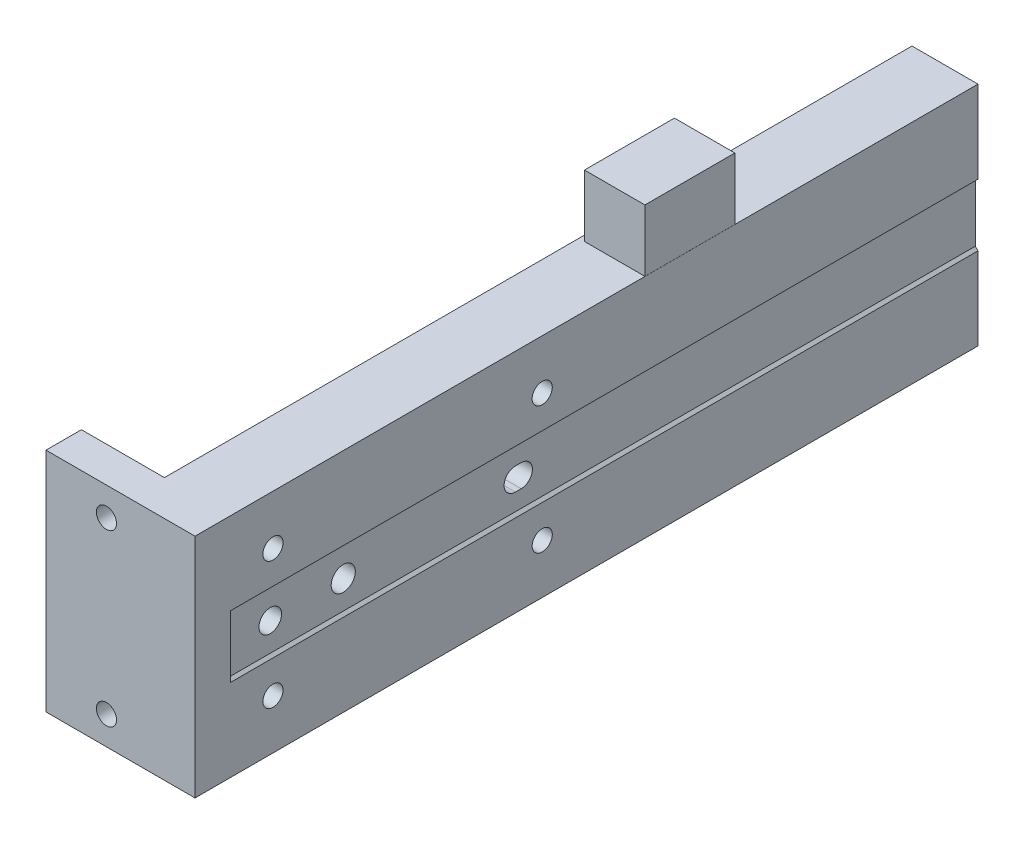
ISO-10303-21;
HEADER;
FILE_DESCRIPTION(('STEP AP214'),'2;1');
FILE_NAME('part.step','',(''),(''),'','','');
FILE_SCHEMA(('AUTOMOTIVE_DESIGN { 1 0 10303 214 1 1 1 1 }'));
ENDSEC;
DATA;
#1=APPLICATION_CONTEXT('core data for automotive mechanical design processes');
#2=APPLICATION_PROTOCOL_DEFINITION('international standard','automotive_design',2000,#1);
#3=PRODUCT_CONTEXT('',#1,'mechanical');
#4=PRODUCT('Part','Part','',(#3));
#5=PRODUCT_RELATED_PRODUCT_CATEGORY('part','',(#4));
#6=PRODUCT_DEFINITION_FORMATION('','',#4);
#7=PRODUCT_DEFINITION_CONTEXT('part definition',#1,'design');
#8=PRODUCT_DEFINITION('design','',#6,#7);
#9=PRODUCT_DEFINITION_SHAPE('','',#8);
#10=(LENGTH_UNIT() NAMED_UNIT(*) SI_UNIT(.MILLI.,.METRE.));
#11=(NAMED_UNIT(*) PLANE_ANGLE_UNIT() SI_UNIT($,.RADIAN.));
#12=(NAMED_UNIT(*) SI_UNIT($,.STERADIAN.) SOLID_ANGLE_UNIT());
#13=UNCERTAINTY_MEASURE_WITH_UNIT(LENGTH_MEASURE(1.E-05),#10,'distance_accuracy_value','');
#14=(GEOMETRIC_REPRESENTATION_CONTEXT(3) GLOBAL_UNCERTAINTY_ASSIGNED_CONTEXT((#13)) GLOBAL_UNIT_ASSIGNED_CONTEXT((#10,
#11,#12)) REPRESENTATION_CONTEXT('',''));
#15=CARTESIAN_POINT('',(0.,0.,0.));
#16=DIRECTION('',(0.,0.,1.));
#17=DIRECTION('',(1.,0.,0.));
#18=AXIS2_PLACEMENT_3D('',#15,#16,#17);
#19=CARTESIAN_POINT('',(-5.12130000000008,16.0000000000001,-899.276836465885));
#20=DIRECTION('',(0.,-1.,0.));
#21=DIRECTION('',(0.,0.,-1.));
#22=AXIS2_PLACEMENT_3D('',#19,#20,#21);
#23=PLANE('',#22);
#24=DIRECTION('',(-1.,0.,0.));
#25=VECTOR('',#24,1.);
#26=CARTESIAN_POINT('',(-5.12130000000008,16.0000000000001,-937.568622791415));
#27=LINE('',#26,#25);
#28=CARTESIAN_POINT('',(15.9086999999999,16.0000000000001,-937.568622791415));
#29=VERTEX_POINT('',#28);
#30=CARTESIAN_POINT('',(-5.12130000000008,16.0000000000001,-937.568622791415));
#31=VERTEX_POINT('',#30);
#32=EDGE_CURVE('E409',#29,#31,#27,.T.);
#33=ORIENTED_EDGE('',*,*,#32,.F.);
#34=DIRECTION('',(0.,0.,-1.));
#35=VECTOR('',#34,1.);
#36=CARTESIAN_POINT('',(15.9086999999999,16.0000000000001,-899.276836465885));
#37=LINE('',#36,#35);
#38=CARTESIAN_POINT('',(15.9086999999999,16.0000000000001,-1048.06862279141));
#39=VERTEX_POINT('',#38);
#40=EDGE_CURVE('E414',#29,#39,#37,.T.);
#41=ORIENTED_EDGE('',*,*,#40,.T.);
#42=DIRECTION('',(-1.,0.,0.));
#43=VECTOR('',#42,1.);
#44=CARTESIAN_POINT('',(15.9086999999999,16.0000000000001,-1048.06862279141));
#45=LINE('',#44,#43);
#46=CARTESIAN_POINT('',(6.59129999999991,16.0000000000001,-1048.06862279141));
#47=VERTEX_POINT('',#46);
#48=EDGE_CURVE('E303',#39,#47,#45,.T.);
#49=ORIENTED_EDGE('',*,*,#48,.T.);
#50=DIRECTION('',(0.,0.,1.));
#51=VECTOR('',#50,1.);
#52=CARTESIAN_POINT('',(6.59129999999991,16.0000000000001,-1081.3974983014));
#53=LINE('',#52,#51);
#54=CARTESIAN_POINT('',(6.59129999999991,16.0000000000001,-942.568622791415));
#55=VERTEX_POINT('',#54);
#56=EDGE_CURVE('E333',#47,#55,#53,.T.);
#57=ORIENTED_EDGE('',*,*,#56,.T.);
#58=DIRECTION('',(-1.,0.,0.));
#59=VECTOR('',#58,1.);
#60=CARTESIAN_POINT('',(-5.12130000000008,16.0000000000001,-942.568622791415));
#61=LINE('',#60,#59);
#62=CARTESIAN_POINT('',(-5.12130000000008,16.0000000000001,-942.568622791415));
#63=VERTEX_POINT('',#62);
#64=EDGE_CURVE('E412',#55,#63,#61,.T.);
#65=ORIENTED_EDGE('',*,*,#64,.T.);
#66=DIRECTION('',(0.,0.,-1.));
#67=VECTOR('',#66,1.);
#68=CARTESIAN_POINT('',(-5.12130000000008,16.0000000000001,-899.276836465885));
#69=LINE('',#68,#67);
#70=EDGE_CURVE('E325',#31,#63,#69,.T.);
#71=ORIENTED_EDGE('',*,*,#70,.F.);
#72=EDGE_LOOP('',(#33,#41,#49,#57,#65,#71));
#73=FACE_BOUND('',#72,.T.);
#74=DIRECTION('',(0.,0.,-1.));
#75=VECTOR('',#74,1.);
#76=CARTESIAN_POINT('',(15.8986999999999,16.0000000000002,-1001.06862279141));
#77=LINE('',#76,#75);
#78=CARTESIAN_POINT('',(15.8986999999999,16.0000000000002,-1001.06862279141));
#79=VERTEX_POINT('',#78);
#80=CARTESIAN_POINT('',(15.8986999999999,16.0000000000001,-1013.76862279141));
#81=VERTEX_POINT('',#80);
#82=EDGE_CURVE('E189',#79,#81,#77,.T.);
#83=ORIENTED_EDGE('',*,*,#82,.F.);
#84=DIRECTION('',(1.,0.,0.));
#85=VECTOR('',#84,1.);
#86=CARTESIAN_POINT('',(15.8986999999999,16.0000000000002,-1001.06862279141));
#87=LINE('',#86,#85);
#88=CARTESIAN_POINT('',(7.36869999999985,16.0000000000001,-1001.06862279141));
#89=VERTEX_POINT('',#88);
#90=EDGE_CURVE('E186',#89,#79,#87,.T.);
#91=ORIENTED_EDGE('',*,*,#90,.F.);
#92=DIRECTION('',(0.,0.,1.));
#93=VECTOR('',#92,1.);
#94=CARTESIAN_POINT('',(7.36869999999992,16.0000000000002,-1001.06862279141));
#95=LINE('',#94,#93);
#96=CARTESIAN_POINT('',(7.36869999999991,16.0000000000001,-1013.76862279141));
#97=VERTEX_POINT('',#96);
#98=EDGE_CURVE('E53',#97,#89,#95,.T.);
#99=ORIENTED_EDGE('',*,*,#98,.F.);
#100=DIRECTION('',(-1.,0.,0.));
#101=VECTOR('',#100,1.);
#102=CARTESIAN_POINT('',(15.8986999999999,16.0000000000002,-1013.76862279141));
#103=LINE('',#102,#101);
#104=EDGE_CURVE('E48',#81,#97,#103,.T.);
#105=ORIENTED_EDGE('',*,*,#104,.F.);
#106=EDGE_LOOP('',(#83,#91,#99,#105));
#107=FACE_BOUND('',#106,.T.);
#108=ADVANCED_FACE('F31',(#73,#107),#23,.F.);
#109=CARTESIAN_POINT('',(15.5287000000001,-4.,-899.276836465885));
#110=DIRECTION('',(-0.707106781186548,-0.707106781186547,0.));
#111=DIRECTION('',(0.707106781186547,-0.707106781186548,0.));
#112=AXIS2_PLACEMENT_3D('',#109,#110,#111);
#113=PLANE('',#112);
#114=DIRECTION('',(-0.707106781186547,0.707106781186548,0.));
#115=VECTOR('',#114,1.);
#116=CARTESIAN_POINT('',(15.9087000000001,-4.38,-942.568622791415));
#117=LINE('',#116,#115);
#118=CARTESIAN_POINT('',(15.9087000000001,-4.38,-942.568622791415));
#119=VERTEX_POINT('',#118);
#120=CARTESIAN_POINT('',(15.5287000000001,-4.,-942.568622791415));
#121=VERTEX_POINT('',#120);
#122=EDGE_CURVE('E296',#119,#121,#117,.T.);
#123=ORIENTED_EDGE('',*,*,#122,.F.);
#124=DIRECTION('',(0.,0.,-1.));
#125=VECTOR('',#124,1.);
#126=CARTESIAN_POINT('',(15.9087000000001,-4.38,-899.276836465885));
#127=LINE('',#126,#125);
#128=CARTESIAN_POINT('',(15.9087000000001,-4.38,-1048.06862279141));
#129=VERTEX_POINT('',#128);
#130=EDGE_CURVE('E423',#119,#129,#127,.T.);
#131=ORIENTED_EDGE('',*,*,#130,.T.);
#132=DIRECTION('',(-0.707106781186547,0.707106781186548,0.));
#133=VECTOR('',#132,1.);
#134=CARTESIAN_POINT('',(15.9087000000001,-4.38,-1048.06862279141));
#135=LINE('',#134,#133);
#136=CARTESIAN_POINT('',(15.5287000000001,-4.,-1048.06862279141));
#137=VERTEX_POINT('',#136);
#138=EDGE_CURVE('E316',#129,#137,#135,.T.);
#139=ORIENTED_EDGE('',*,*,#138,.T.);
#140=DIRECTION('',(0.,0.,-1.));
#141=VECTOR('',#140,1.);
#142=CARTESIAN_POINT('',(15.5287000000001,-4.,-899.276836465885));
#143=LINE('',#142,#141);
#144=EDGE_CURVE('E425',#121,#137,#143,.T.);
#145=ORIENTED_EDGE('',*,*,#144,.F.);
#146=EDGE_LOOP('',(#123,#131,#139,#145));
#147=FACE_BOUND('',#146,.T.);
#148=ADVANCED_FACE('F363',(#147),#113,.F.);
#149=CARTESIAN_POINT('',(15.5287000000001,4.,-899.276836465885));
#150=DIRECTION('',(-1.,0.,0.));
#151=DIRECTION('',(0.,0.,1.));
#152=AXIS2_PLACEMENT_3D('',#149,#150,#151);
#153=PLANE('',#152);
#154=CARTESIAN_POINT('',(15.5287000000001,1.11542008690021E-13,-948.568622791415));
#155=DIRECTION('',(1.,0.,0.));
#156=DIRECTION('',(0.,0.,-1.));
#157=AXIS2_PLACEMENT_3D('',#154,#155,#156);
#158=CIRCLE('',#157,1.59385000000001);
#159=CARTESIAN_POINT('',(15.5287000000001,1.11542008690021E-13,-950.162472791415));
#160=VERTEX_POINT('',#159);
#161=EDGE_CURVE('E190',#160,#160,#158,.T.);
#162=ORIENTED_EDGE('',*,*,#161,.F.);
#163=EDGE_LOOP('',(#162));
#164=FACE_BOUND('',#163,.T.);
#165=DIRECTION('',(0.,0.,-1.));
#166=VECTOR('',#165,1.);
#167=CARTESIAN_POINT('',(15.5287000000001,-1.59384999999989,-983.162472791415));
#168=LINE('',#167,#166);
#169=CARTESIAN_POINT('',(15.5287000000001,-1.59384999999989,-983.162472791415));
#170=VERTEX_POINT('',#169);
#171=CARTESIAN_POINT('',(15.5287000000001,-1.59384999999989,-983.974772791415));
#172=VERTEX_POINT('',#171);
#173=EDGE_CURVE('E217',#170,#172,#168,.T.);
#174=ORIENTED_EDGE('',*,*,#173,.F.);
#175=CARTESIAN_POINT('',(15.5287000000001,1.114425339159E-13,-983.162472791415));
#176=DIRECTION('',(1.,0.,0.));
#177=DIRECTION('',(0.,0.,-1.));
#178=AXIS2_PLACEMENT_3D('',#175,#176,#177);
#179=CIRCLE('',#178,1.59385);
#180=CARTESIAN_POINT('',(15.5287000000001,1.59385000000011,-983.162472791415));
#181=VERTEX_POINT('',#180);
#182=EDGE_CURVE('E201',#181,#170,#179,.T.);
#183=ORIENTED_EDGE('',*,*,#182,.F.);
#184=DIRECTION('',(0.,0.,1.));
#185=VECTOR('',#184,1.);
#186=CARTESIAN_POINT('',(15.5287000000001,1.59385000000011,-983.162472791415));
#187=LINE('',#186,#185);
#188=CARTESIAN_POINT('',(15.5287000000001,1.59385000000011,-983.974772791415));
#189=VERTEX_POINT('',#188);
#190=EDGE_CURVE('E206',#189,#181,#187,.T.);
#191=ORIENTED_EDGE('',*,*,#190,.F.);
#192=CARTESIAN_POINT('',(15.5287000000001,1.11542008690021E-13,-983.974772791415));
#193=DIRECTION('',(1.,0.,0.));
#194=DIRECTION('',(0.,0.,-1.));
#195=AXIS2_PLACEMENT_3D('',#192,#193,#194);
#196=CIRCLE('',#195,1.59385);
#197=EDGE_CURVE('E220',#172,#189,#196,.T.);
#198=ORIENTED_EDGE('',*,*,#197,.F.);
#199=EDGE_LOOP('',(#174,#183,#191,#198));
#200=FACE_BOUND('',#199,.T.);
#201=CARTESIAN_POINT('',(15.5287000000001,1.11542008690021E-13,-958.868622791415));
#202=DIRECTION('',(1.,0.,0.));
#203=DIRECTION('',(0.,0.,-1.));
#204=AXIS2_PLACEMENT_3D('',#201,#202,#203);
#205=CIRCLE('',#204,1.7);
#206=CARTESIAN_POINT('',(15.5287000000001,1.11542008690021E-13,-960.568622791415));
#207=VERTEX_POINT('',#206);
#208=EDGE_CURVE('E290',#207,#207,#205,.T.);
#209=ORIENTED_EDGE('',*,*,#208,.F.);
#210=EDGE_LOOP('',(#209));
#211=FACE_BOUND('',#210,.T.);
#212=DIRECTION('',(0.,1.,0.));
#213=VECTOR('',#212,1.);
#214=CARTESIAN_POINT('',(15.5287000000001,-4.,-942.568622791415));
#215=LINE('',#214,#213);
#216=CARTESIAN_POINT('',(15.5287000000001,4.,-942.568622791415));
#217=VERTEX_POINT('',#216);
#218=EDGE_CURVE('E294',#121,#217,#215,.T.);
#219=ORIENTED_EDGE('',*,*,#218,.F.);
#220=ORIENTED_EDGE('',*,*,#144,.T.);
#221=DIRECTION('',(0.,1.,0.));
#222=VECTOR('',#221,1.);
#223=CARTESIAN_POINT('',(15.5287000000001,-4.,-1048.06862279141));
#224=LINE('',#223,#222);
#225=CARTESIAN_POINT('',(15.5287000000001,4.,-1048.06862279141));
#226=VERTEX_POINT('',#225);
#227=EDGE_CURVE('E319',#137,#226,#224,.T.);
#228=ORIENTED_EDGE('',*,*,#227,.T.);
#229=DIRECTION('',(0.,0.,-1.));
#230=VECTOR('',#229,1.);
#231=CARTESIAN_POINT('',(15.5287000000001,4.,-899.276836465885));
#232=LINE('',#231,#230);
#233=EDGE_CURVE('E427',#217,#226,#232,.T.);
#234=ORIENTED_EDGE('',*,*,#233,.F.);
#235=EDGE_LOOP('',(#219,#220,#228,#234));
#236=FACE_BOUND('',#235,.T.);
#237=ADVANCED_FACE('F369',(#164,#200,#211,#236),#153,.F.);
#238=CARTESIAN_POINT('',(15.5287000000001,4.,-899.276836465885));
#239=DIRECTION('',(-0.707106781186548,0.707106781186547,0.));
#240=DIRECTION('',(-0.707106781186547,-0.707106781186548,0.));
#241=AXIS2_PLACEMENT_3D('',#238,#239,#240);
#242=PLANE('',#241);
#243=DIRECTION('',(0.707106781186547,0.707106781186548,0.));
#244=VECTOR('',#243,1.);
#245=CARTESIAN_POINT('',(15.5287000000001,4.,-942.568622791415));
#246=LINE('',#245,#244);
#247=CARTESIAN_POINT('',(15.9087000000001,4.38,-942.568622791415));
#248=VERTEX_POINT('',#247);
#249=EDGE_CURVE('E300',#217,#248,#246,.T.);
#250=ORIENTED_EDGE('',*,*,#249,.F.);
#251=ORIENTED_EDGE('',*,*,#233,.T.);
#252=DIRECTION('',(0.707106781186547,0.707106781186548,0.));
#253=VECTOR('',#252,1.);
#254=CARTESIAN_POINT('',(15.5287000000001,4.,-1048.06862279141));
#255=LINE('',#254,#253);
#256=CARTESIAN_POINT('',(15.9087000000001,4.38,-1048.06862279141));
#257=VERTEX_POINT('',#256);
#258=EDGE_CURVE('E322',#226,#257,#255,.T.);
#259=ORIENTED_EDGE('',*,*,#258,.T.);
#260=DIRECTION('',(0.,0.,-1.));
#261=VECTOR('',#260,1.);
#262=CARTESIAN_POINT('',(15.9087000000001,4.38,-899.276836465885));
#263=LINE('',#262,#261);
#264=EDGE_CURVE('E429',#248,#257,#263,.T.);
#265=ORIENTED_EDGE('',*,*,#264,.F.);
#266=EDGE_LOOP('',(#250,#251,#259,#265));
#267=FACE_BOUND('',#266,.T.);
#268=ADVANCED_FACE('F377',(#267),#242,.F.);
#269=CARTESIAN_POINT('',(-5.12130000000008,-16.0000000000001,-942.568622791415));
#270=DIRECTION('',(0.,0.,1.));
#271=DIRECTION('',(1.,0.,0.));
#272=AXIS2_PLACEMENT_3D('',#269,#270,#271);
#273=PLANE('',#272);
#274=CARTESIAN_POINT('',(3.40870000000017,12.,-942.568622791415));
#275=DIRECTION('',(0.,0.,1.));
#276=DIRECTION('',(1.,0.,0.));
#277=AXIS2_PLACEMENT_3D('',#274,#275,#276);
#278=CIRCLE('',#277,1.4224);
#279=CARTESIAN_POINT('',(4.83110000000016,12.,-942.568622791415));
#280=VERTEX_POINT('',#279);
#281=EDGE_CURVE('E35',#280,#280,#278,.T.);
#282=ORIENTED_EDGE('',*,*,#281,.T.);
#283=EDGE_LOOP('',(#282));
#284=FACE_BOUND('',#283,.T.);
#285=CARTESIAN_POINT('',(3.40870000000017,-12.,-942.568622791415));
#286=DIRECTION('',(0.,0.,1.));
#287=DIRECTION('',(1.,0.,0.));
#288=AXIS2_PLACEMENT_3D('',#285,#286,#287);
#289=CIRCLE('',#288,1.4224);
#290=CARTESIAN_POINT('',(4.83110000000016,-12.,-942.568622791415));
#291=VERTEX_POINT('',#290);
#292=EDGE_CURVE('E239',#291,#291,#289,.T.);
#293=ORIENTED_EDGE('',*,*,#292,.T.);
#294=EDGE_LOOP('',(#293));
#295=FACE_BOUND('',#294,.T.);
#296=DIRECTION('',(0.,1.,0.));
#297=VECTOR('',#296,1.);
#298=CARTESIAN_POINT('',(6.59129999999991,16.0000000000001,-942.568622791415));
#299=LINE('',#298,#297);
#300=CARTESIAN_POINT('',(6.59129999999991,-16.0000000000001,-942.568622791415));
#301=VERTEX_POINT('',#300);
#302=EDGE_CURVE('E302',#301,#55,#299,.T.);
#303=ORIENTED_EDGE('',*,*,#302,.F.);
#304=DIRECTION('',(1.,0.,0.));
#305=VECTOR('',#304,1.);
#306=CARTESIAN_POINT('',(-5.12130000000008,-16.0000000000001,-942.568622791415));
#307=LINE('',#306,#305);
#308=CARTESIAN_POINT('',(-5.12130000000008,-16.0000000000001,-942.568622791415));
#309=VERTEX_POINT('',#308);
#310=EDGE_CURVE('E419',#309,#301,#307,.T.);
#311=ORIENTED_EDGE('',*,*,#310,.F.);
#312=DIRECTION('',(0.,-1.,0.));
#313=VECTOR('',#312,1.);
#314=CARTESIAN_POINT('',(-5.12130000000008,16.0000000000001,-942.568622791415));
#315=LINE('',#314,#313);
#316=EDGE_CURVE('E420',#63,#309,#315,.T.);
#317=ORIENTED_EDGE('',*,*,#316,.F.);
#318=ORIENTED_EDGE('',*,*,#64,.F.);
#319=EDGE_LOOP('',(#303,#311,#317,#318));
#320=FACE_BOUND('',#319,.T.);
#321=ADVANCED_FACE('F375',(#284,#295,#320),#273,.F.);
#322=CARTESIAN_POINT('',(-5.12130000000008,16.0000000000001,-899.276836465885));
#323=DIRECTION('',(1.,0.,0.));
#324=DIRECTION('',(0.,0.,-1.));
#325=AXIS2_PLACEMENT_3D('',#322,#323,#324);
#326=PLANE('',#325);
#327=DIRECTION('',(0.,-1.,0.));
#328=VECTOR('',#327,1.);
#329=CARTESIAN_POINT('',(-5.12130000000008,16.0000000000001,-937.568622791415));
#330=LINE('',#329,#328);
#331=CARTESIAN_POINT('',(-5.12130000000008,-16.0000000000001,-937.568622791415));
#332=VERTEX_POINT('',#331);
#333=EDGE_CURVE('E402',#31,#332,#330,.T.);
#334=ORIENTED_EDGE('',*,*,#333,.F.);
#335=ORIENTED_EDGE('',*,*,#70,.T.);
#336=ORIENTED_EDGE('',*,*,#316,.T.);
#337=DIRECTION('',(0.,0.,-1.));
#338=VECTOR('',#337,1.);
#339=CARTESIAN_POINT('',(-5.12130000000008,-16.0000000000001,-899.276836465885));
#340=LINE('',#339,#338);
#341=EDGE_CURVE('E406',#332,#309,#340,.T.);
#342=ORIENTED_EDGE('',*,*,#341,.F.);
#343=EDGE_LOOP('',(#334,#335,#336,#342));
#344=FACE_BOUND('',#343,.T.);
#345=ADVANCED_FACE('F390',(#344),#326,.F.);
#346=CARTESIAN_POINT('',(-5.12130000000008,-16.0000000000001,-899.276836465885));
#347=DIRECTION('',(0.,1.,0.));
#348=DIRECTION('',(0.,0.,1.));
#349=AXIS2_PLACEMENT_3D('',#346,#347,#348);
#350=PLANE('',#349);
#351=DIRECTION('',(1.,0.,0.));
#352=VECTOR('',#351,1.);
#353=CARTESIAN_POINT('',(-5.12130000000008,-16.0000000000001,-937.568622791415));
#354=LINE('',#353,#352);
#355=CARTESIAN_POINT('',(15.9086999999999,-16.0000000000001,-937.568622791415));
#356=VERTEX_POINT('',#355);
#357=EDGE_CURVE('E40',#332,#356,#354,.T.);
#358=ORIENTED_EDGE('',*,*,#357,.F.);
#359=ORIENTED_EDGE('',*,*,#341,.T.);
#360=ORIENTED_EDGE('',*,*,#310,.T.);
#361=DIRECTION('',(0.,0.,1.));
#362=VECTOR('',#361,1.);
#363=CARTESIAN_POINT('',(6.59129999999992,-16.0000000000001,-1081.3974983014));
#364=LINE('',#363,#362);
#365=CARTESIAN_POINT('',(6.59129999999992,-16.0000000000001,-1048.06862279141));
#366=VERTEX_POINT('',#365);
#367=EDGE_CURVE('E336',#366,#301,#364,.T.);
#368=ORIENTED_EDGE('',*,*,#367,.F.);
#369=DIRECTION('',(1.,0.,0.));
#370=VECTOR('',#369,1.);
#371=CARTESIAN_POINT('',(6.59129999999992,-16.0000000000001,-1048.06862279141));
#372=LINE('',#371,#370);
#373=CARTESIAN_POINT('',(15.9086999999999,-16.0000000000001,-1048.06862279141));
#374=VERTEX_POINT('',#373);
#375=EDGE_CURVE('E310',#366,#374,#372,.T.);
#376=ORIENTED_EDGE('',*,*,#375,.T.);
#377=DIRECTION('',(0.,0.,-1.));
#378=VECTOR('',#377,1.);
#379=CARTESIAN_POINT('',(15.9086999999999,-16.0000000000001,-899.276836465885));
#380=LINE('',#379,#378);
#381=EDGE_CURVE('E421',#356,#374,#380,.T.);
#382=ORIENTED_EDGE('',*,*,#381,.F.);
#383=EDGE_LOOP('',(#358,#359,#360,#368,#376,#382));
#384=FACE_BOUND('',#383,.T.);
#385=ADVANCED_FACE('F387',(#384),#350,.F.);
#386=CARTESIAN_POINT('',(15.9087000000001,-4.38,-899.276836465885));
#387=DIRECTION('',(-1.,0.,0.));
#388=DIRECTION('',(0.,-1.,0.));
#389=AXIS2_PLACEMENT_3D('',#386,#387,#388);
#390=PLANE('',#389);
#391=CARTESIAN_POINT('',(15.9087000000002,9.00000000000011,-948.568622791415));
#392=DIRECTION('',(1.,0.,0.));
#393=DIRECTION('',(0.,0.,-1.));
#394=AXIS2_PLACEMENT_3D('',#391,#392,#393);
#395=CIRCLE('',#394,1.4224);
#396=CARTESIAN_POINT('',(15.9087000000002,9.00000000000011,-949.991022791415));
#397=VERTEX_POINT('',#396);
#398=EDGE_CURVE('E251',#397,#397,#395,.T.);
#399=ORIENTED_EDGE('',*,*,#398,.F.);
#400=EDGE_LOOP('',(#399));
#401=FACE_BOUND('',#400,.T.);
#402=CARTESIAN_POINT('',(15.9087000000002,9.00000000000011,-986.568622791415));
#403=DIRECTION('',(1.,0.,0.));
#404=DIRECTION('',(0.,0.,-1.));
#405=AXIS2_PLACEMENT_3D('',#402,#403,#404);
#406=CIRCLE('',#405,1.4224);
#407=CARTESIAN_POINT('',(15.9087000000002,9.00000000000011,-987.991022791415));
#408=VERTEX_POINT('',#407);
#409=EDGE_CURVE('E263',#408,#408,#406,.T.);
#410=ORIENTED_EDGE('',*,*,#409,.F.);
#411=EDGE_LOOP('',(#410));
#412=FACE_BOUND('',#411,.T.);
#413=CARTESIAN_POINT('',(15.9087000000001,-8.99999999999989,-948.568622791415));
#414=DIRECTION('',(1.,0.,0.));
#415=DIRECTION('',(0.,0.,-1.));
#416=AXIS2_PLACEMENT_3D('',#413,#414,#415);
#417=CIRCLE('',#416,1.4224);
#418=CARTESIAN_POINT('',(15.9087000000001,-8.99999999999989,-949.991022791415));
#419=VERTEX_POINT('',#418);
#420=EDGE_CURVE('E275',#419,#419,#417,.T.);
#421=ORIENTED_EDGE('',*,*,#420,.F.);
#422=EDGE_LOOP('',(#421));
#423=FACE_BOUND('',#422,.T.);
#424=CARTESIAN_POINT('',(15.9087000000001,-8.99999999999989,-986.568622791415));
#425=DIRECTION('',(1.,0.,0.));
#426=DIRECTION('',(0.,0.,-1.));
#427=AXIS2_PLACEMENT_3D('',#424,#425,#426);
#428=CIRCLE('',#427,1.4224);
#429=CARTESIAN_POINT('',(15.9087000000001,-8.99999999999989,-987.991022791415));
#430=VERTEX_POINT('',#429);
#431=EDGE_CURVE('E287',#430,#430,#428,.T.);
#432=ORIENTED_EDGE('',*,*,#431,.F.);
#433=EDGE_LOOP('',(#432));
#434=FACE_BOUND('',#433,.T.);
#435=DIRECTION('',(0.,1.,0.));
#436=VECTOR('',#435,1.);
#437=CARTESIAN_POINT('',(15.9087000000001,-4.38,-937.568622791415));
#438=LINE('',#437,#436);
#439=EDGE_CURVE('E11',#356,#29,#438,.T.);
#440=ORIENTED_EDGE('',*,*,#439,.F.);
#441=ORIENTED_EDGE('',*,*,#381,.T.);
#442=DIRECTION('',(0.,1.,0.));
#443=VECTOR('',#442,1.);
#444=CARTESIAN_POINT('',(15.9086999999999,-16.0000000000001,-1048.06862279141));
#445=LINE('',#444,#443);
#446=EDGE_CURVE('E313',#374,#129,#445,.T.);
#447=ORIENTED_EDGE('',*,*,#446,.T.);
#448=ORIENTED_EDGE('',*,*,#130,.F.);
#449=DIRECTION('',(0.,-1.,0.));
#450=VECTOR('',#449,1.);
#451=CARTESIAN_POINT('',(15.9087000000001,-4.38,-942.568622791415));
#452=LINE('',#451,#450);
#453=EDGE_CURVE('E298',#248,#119,#452,.T.);
#454=ORIENTED_EDGE('',*,*,#453,.F.);
#455=ORIENTED_EDGE('',*,*,#264,.T.);
#456=DIRECTION('',(0.,1.,0.));
#457=VECTOR('',#456,1.);
#458=CARTESIAN_POINT('',(15.9087000000001,4.38,-1048.06862279141));
#459=LINE('',#458,#457);
#460=EDGE_CURVE('E307',#257,#39,#459,.T.);
#461=ORIENTED_EDGE('',*,*,#460,.T.);
#462=ORIENTED_EDGE('',*,*,#40,.F.);
#463=EDGE_LOOP('',(#440,#441,#447,#448,#454,#455,#461,#462));
#464=FACE_BOUND('',#463,.T.);
#465=ADVANCED_FACE('F384',(#401,#412,#423,#434,#464),#390,.F.);
#466=CARTESIAN_POINT('',(0.,1.11542008690021E-13,-937.568622791415));
#467=DIRECTION('',(0.,0.,1.));
#468=DIRECTION('',(1.,0.,0.));
#469=AXIS2_PLACEMENT_3D('',#466,#467,#468);
#470=PLANE('',#469);
#471=CARTESIAN_POINT('',(3.40870000000017,12.,-937.568622791415));
#472=DIRECTION('',(0.,0.,1.));
#473=DIRECTION('',(1.,0.,0.));
#474=AXIS2_PLACEMENT_3D('',#471,#472,#473);
#475=CIRCLE('',#474,1.4224);
#476=CARTESIAN_POINT('',(4.83110000000017,12.,-937.568622791415));
#477=VERTEX_POINT('',#476);
#478=EDGE_CURVE('E227',#477,#477,#475,.T.);
#479=ORIENTED_EDGE('',*,*,#478,.F.);
#480=EDGE_LOOP('',(#479));
#481=FACE_BOUND('',#480,.T.);
#482=CARTESIAN_POINT('',(3.40870000000017,-12.,-937.568622791415));
#483=DIRECTION('',(0.,0.,1.));
#484=DIRECTION('',(1.,0.,0.));
#485=AXIS2_PLACEMENT_3D('',#482,#483,#484);
#486=CIRCLE('',#485,1.4224);
#487=CARTESIAN_POINT('',(4.83110000000017,-12.,-937.568622791415));
#488=VERTEX_POINT('',#487);
#489=EDGE_CURVE('E236',#488,#488,#486,.T.);
#490=ORIENTED_EDGE('',*,*,#489,.F.);
#491=EDGE_LOOP('',(#490));
#492=FACE_BOUND('',#491,.T.);
#493=ORIENTED_EDGE('',*,*,#32,.T.);
#494=ORIENTED_EDGE('',*,*,#333,.T.);
#495=ORIENTED_EDGE('',*,*,#357,.T.);
#496=ORIENTED_EDGE('',*,*,#439,.T.);
#497=EDGE_LOOP('',(#493,#494,#495,#496));
#498=FACE_BOUND('',#497,.T.);
#499=ADVANCED_FACE('F33',(#481,#492,#498),#470,.T.);
#500=CARTESIAN_POINT('',(6.59129999999991,16.0000000000001,-1081.3974983014));
#501=DIRECTION('',(1.,0.,0.));
#502=DIRECTION('',(0.,1.,0.));
#503=AXIS2_PLACEMENT_3D('',#500,#501,#502);
#504=PLANE('',#503);
#505=CARTESIAN_POINT('',(6.59129999999991,1.11542008690021E-13,-958.868622791415));
#506=DIRECTION('',(1.,0.,0.));
#507=DIRECTION('',(0.,1.,0.));
#508=AXIS2_PLACEMENT_3D('',#505,#506,#507);
#509=CIRCLE('',#508,1.7);
#510=CARTESIAN_POINT('',(6.59129999999991,1.70000000000011,-958.868622791415));
#511=VERTEX_POINT('',#510);
#512=EDGE_CURVE('E293',#511,#511,#509,.T.);
#513=ORIENTED_EDGE('',*,*,#512,.T.);
#514=EDGE_LOOP('',(#513));
#515=FACE_BOUND('',#514,.T.);
#516=ORIENTED_EDGE('',*,*,#56,.F.);
#517=DIRECTION('',(0.,-1.,0.));
#518=VECTOR('',#517,1.);
#519=CARTESIAN_POINT('',(6.59129999999991,16.0000000000001,-1048.06862279141));
#520=LINE('',#519,#518);
#521=EDGE_CURVE('E306',#47,#366,#520,.T.);
#522=ORIENTED_EDGE('',*,*,#521,.T.);
#523=ORIENTED_EDGE('',*,*,#367,.T.);
#524=ORIENTED_EDGE('',*,*,#302,.T.);
#525=EDGE_LOOP('',(#516,#522,#523,#524));
#526=FACE_BOUND('',#525,.T.);
#527=ADVANCED_FACE('F343',(#515,#526),#504,.F.);
#528=CARTESIAN_POINT('',(0.,1.11542008690021E-13,-1048.06862279141));
#529=DIRECTION('',(0.,0.,1.));
#530=DIRECTION('',(1.,0.,0.));
#531=AXIS2_PLACEMENT_3D('',#528,#529,#530);
#532=PLANE('',#531);
#533=ORIENTED_EDGE('',*,*,#227,.F.);
#534=ORIENTED_EDGE('',*,*,#138,.F.);
#535=ORIENTED_EDGE('',*,*,#446,.F.);
#536=ORIENTED_EDGE('',*,*,#375,.F.);
#537=ORIENTED_EDGE('',*,*,#521,.F.);
#538=ORIENTED_EDGE('',*,*,#48,.F.);
#539=ORIENTED_EDGE('',*,*,#460,.F.);
#540=ORIENTED_EDGE('',*,*,#258,.F.);
#541=EDGE_LOOP('',(#533,#534,#535,#536,#537,#538,#539,#540));
#542=FACE_BOUND('',#541,.T.);
#543=ADVANCED_FACE('F359',(#542),#532,.F.);
#544=CARTESIAN_POINT('',(-5.12130000000008,-16.0000000000001,-942.568622791415));
#545=DIRECTION('',(0.,0.,1.));
#546=DIRECTION('',(1.,0.,0.));
#547=AXIS2_PLACEMENT_3D('',#544,#545,#546);
#548=PLANE('',#547);
#549=ORIENTED_EDGE('',*,*,#453,.T.);
#550=ORIENTED_EDGE('',*,*,#122,.T.);
#551=ORIENTED_EDGE('',*,*,#218,.T.);
#552=ORIENTED_EDGE('',*,*,#249,.T.);
#553=EDGE_LOOP('',(#549,#550,#551,#552));
#554=FACE_BOUND('',#553,.T.);
#555=ADVANCED_FACE('F349',(#554),#548,.F.);
#556=CARTESIAN_POINT('',(15.5287000000001,1.11542008690021E-13,-958.868622791415));
#557=DIRECTION('',(1.,0.,0.));
#558=DIRECTION('',(0.,0.,-1.));
#559=AXIS2_PLACEMENT_3D('',#556,#557,#558);
#560=CYLINDRICAL_SURFACE('',#559,1.7);
#561=ORIENTED_EDGE('',*,*,#208,.T.);
#562=EDGE_LOOP('',(#561));
#563=FACE_BOUND('',#562,.T.);
#564=ORIENTED_EDGE('',*,*,#512,.F.);
#565=EDGE_LOOP('',(#564));
#566=FACE_BOUND('',#565,.T.);
#567=ADVANCED_FACE('F346',(#563,#566),#560,.F.);
#568=CARTESIAN_POINT('',(15.9087000000001,-8.99999999999989,-986.568622791415));
#569=DIRECTION('',(1.,0.,0.));
#570=DIRECTION('',(0.,0.,-1.));
#571=AXIS2_PLACEMENT_3D('',#568,#569,#570);
#572=CYLINDRICAL_SURFACE('',#571,1.4224);
#573=CARTESIAN_POINT('',(11.8447000000001,-8.99999999999989,-986.568622791415));
#574=DIRECTION('',(1.,0.,0.));
#575=DIRECTION('',(0.,0.,-1.));
#576=AXIS2_PLACEMENT_3D('',#573,#574,#575);
#577=CIRCLE('',#576,1.4224);
#578=CARTESIAN_POINT('',(11.8447000000001,-8.99999999999989,-987.991022791415));
#579=VERTEX_POINT('',#578);
#580=EDGE_CURVE('E284',#579,#579,#577,.T.);
#581=ORIENTED_EDGE('',*,*,#580,.F.);
#582=EDGE_LOOP('',(#581));
#583=FACE_BOUND('',#582,.T.);
#584=ORIENTED_EDGE('',*,*,#431,.T.);
#585=EDGE_LOOP('',(#584));
#586=FACE_BOUND('',#585,.T.);
#587=ADVANCED_FACE('F348',(#583,#586),#572,.F.);
#588=CARTESIAN_POINT('',(11.8447000000001,-7.86969999999989,-986.568622791415));
#589=DIRECTION('',(-1.,0.,0.));
#590=DIRECTION('',(0.,0.,1.));
#591=AXIS2_PLACEMENT_3D('',#588,#589,#590);
#592=PLANE('',#591);
#593=CARTESIAN_POINT('',(11.8447000000001,-8.99999999999989,-986.568622791415));
#594=DIRECTION('',(1.,0.,0.));
#595=DIRECTION('',(0.,0.,-1.));
#596=AXIS2_PLACEMENT_3D('',#593,#594,#595);
#597=CIRCLE('',#596,1.1303);
#598=CARTESIAN_POINT('',(11.8447000000001,-8.99999999999989,-987.698922791415));
#599=VERTEX_POINT('',#598);
#600=EDGE_CURVE('E281',#599,#599,#597,.T.);
#601=ORIENTED_EDGE('',*,*,#600,.F.);
#602=EDGE_LOOP('',(#601));
#603=FACE_BOUND('',#602,.T.);
#604=ORIENTED_EDGE('',*,*,#580,.T.);
#605=EDGE_LOOP('',(#604));
#606=FACE_BOUND('',#605,.T.);
#607=ADVANCED_FACE('F356',(#603,#606),#592,.F.);
#608=CARTESIAN_POINT('',(15.9087000000001,-8.99999999999989,-986.568622791415));
#609=DIRECTION('',(1.,0.,0.));
#610=DIRECTION('',(0.,0.,-1.));
#611=AXIS2_PLACEMENT_3D('',#608,#609,#610);
#612=CYLINDRICAL_SURFACE('',#611,1.1303);
#613=CARTESIAN_POINT('',(8.66970000000014,-8.99999999999989,-986.568622791415));
#614=DIRECTION('',(1.,0.,0.));
#615=DIRECTION('',(0.,0.,-1.));
#616=AXIS2_PLACEMENT_3D('',#613,#614,#615);
#617=CIRCLE('',#616,1.1303);
#618=CARTESIAN_POINT('',(8.66970000000014,-8.99999999999989,-987.698922791415));
#619=VERTEX_POINT('',#618);
#620=EDGE_CURVE('E278',#619,#619,#617,.T.);
#621=ORIENTED_EDGE('',*,*,#620,.F.);
#622=EDGE_LOOP('',(#621));
#623=FACE_BOUND('',#622,.T.);
#624=ORIENTED_EDGE('',*,*,#600,.T.);
#625=EDGE_LOOP('',(#624));
#626=FACE_BOUND('',#625,.T.);
#627=ADVANCED_FACE('F541',(#623,#626),#612,.F.);
#628=CARTESIAN_POINT('',(8.66970000000014,-8.99999999999989,-986.568622791415));
#629=DIRECTION('',(1.,0.,0.));
#630=DIRECTION('',(0.,0.,-1.));
#631=AXIS2_PLACEMENT_3D('',#628,#629,#630);
#632=CONICAL_SURFACE('',#631,1.1303,1.02974425867665);
#633=CARTESIAN_POINT('',(7.99054724231329,-8.99999999999989,-986.568622791415));
#634=VERTEX_POINT('',#633);
#635=VERTEX_LOOP('',#634);
#636=FACE_BOUND('',#635,.T.);
#637=ORIENTED_EDGE('',*,*,#620,.T.);
#638=EDGE_LOOP('',(#637));
#639=FACE_BOUND('',#638,.T.);
#640=ADVANCED_FACE('F537',(#636,#639),#632,.F.);
#641=CARTESIAN_POINT('',(15.9087000000001,-8.99999999999989,-948.568622791415));
#642=DIRECTION('',(1.,0.,0.));
#643=DIRECTION('',(0.,0.,-1.));
#644=AXIS2_PLACEMENT_3D('',#641,#642,#643);
#645=CYLINDRICAL_SURFACE('',#644,1.4224);
#646=CARTESIAN_POINT('',(11.8447000000001,-8.99999999999989,-948.568622791415));
#647=DIRECTION('',(1.,0.,0.));
#648=DIRECTION('',(0.,0.,-1.));
#649=AXIS2_PLACEMENT_3D('',#646,#647,#648);
#650=CIRCLE('',#649,1.4224);
#651=CARTESIAN_POINT('',(11.8447000000001,-8.99999999999989,-949.991022791415));
#652=VERTEX_POINT('',#651);
#653=EDGE_CURVE('E272',#652,#652,#650,.T.);
#654=ORIENTED_EDGE('',*,*,#653,.F.);
#655=EDGE_LOOP('',(#654));
#656=FACE_BOUND('',#655,.T.);
#657=ORIENTED_EDGE('',*,*,#420,.T.);
#658=EDGE_LOOP('',(#657));
#659=FACE_BOUND('',#658,.T.);
#660=ADVANCED_FACE('F533',(#656,#659),#645,.F.);
#661=CARTESIAN_POINT('',(11.8447000000001,-7.86969999999989,-948.568622791415));
#662=DIRECTION('',(-1.,0.,0.));
#663=DIRECTION('',(0.,0.,1.));
#664=AXIS2_PLACEMENT_3D('',#661,#662,#663);
#665=PLANE('',#664);
#666=CARTESIAN_POINT('',(11.8447000000001,-8.99999999999989,-948.568622791415));
#667=DIRECTION('',(1.,0.,0.));
#668=DIRECTION('',(0.,0.,-1.));
#669=AXIS2_PLACEMENT_3D('',#666,#667,#668);
#670=CIRCLE('',#669,1.1303);
#671=CARTESIAN_POINT('',(11.8447000000001,-8.99999999999989,-949.698922791415));
#672=VERTEX_POINT('',#671);
#673=EDGE_CURVE('E269',#672,#672,#670,.T.);
#674=ORIENTED_EDGE('',*,*,#673,.F.);
#675=EDGE_LOOP('',(#674));
#676=FACE_BOUND('',#675,.T.);
#677=ORIENTED_EDGE('',*,*,#653,.T.);
#678=EDGE_LOOP('',(#677));
#679=FACE_BOUND('',#678,.T.);
#680=ADVANCED_FACE('F529',(#676,#679),#665,.F.);
#681=CARTESIAN_POINT('',(15.9087000000001,-8.99999999999989,-948.568622791415));
#682=DIRECTION('',(1.,0.,0.));
#683=DIRECTION('',(0.,0.,-1.));
#684=AXIS2_PLACEMENT_3D('',#681,#682,#683);
#685=CYLINDRICAL_SURFACE('',#684,1.1303);
#686=CARTESIAN_POINT('',(8.66970000000014,-8.99999999999989,-948.568622791415));
#687=DIRECTION('',(1.,0.,0.));
#688=DIRECTION('',(0.,0.,-1.));
#689=AXIS2_PLACEMENT_3D('',#686,#687,#688);
#690=CIRCLE('',#689,1.1303);
#691=CARTESIAN_POINT('',(8.66970000000014,-8.99999999999989,-949.698922791415));
#692=VERTEX_POINT('',#691);
#693=EDGE_CURVE('E266',#692,#692,#690,.T.);
#694=ORIENTED_EDGE('',*,*,#693,.F.);
#695=EDGE_LOOP('',(#694));
#696=FACE_BOUND('',#695,.T.);
#697=ORIENTED_EDGE('',*,*,#673,.T.);
#698=EDGE_LOOP('',(#697));
#699=FACE_BOUND('',#698,.T.);
#700=ADVANCED_FACE('F525',(#696,#699),#685,.F.);
#701=CARTESIAN_POINT('',(8.66970000000014,-8.99999999999989,-948.568622791415));
#702=DIRECTION('',(1.,0.,0.));
#703=DIRECTION('',(0.,0.,-1.));
#704=AXIS2_PLACEMENT_3D('',#701,#702,#703);
#705=CONICAL_SURFACE('',#704,1.1303,1.02974425867665);
#706=CARTESIAN_POINT('',(7.99054724231329,-8.99999999999989,-948.568622791415));
#707=VERTEX_POINT('',#706);
#708=VERTEX_LOOP('',#707);
#709=FACE_BOUND('',#708,.T.);
#710=ORIENTED_EDGE('',*,*,#693,.T.);
#711=EDGE_LOOP('',(#710));
#712=FACE_BOUND('',#711,.T.);
#713=ADVANCED_FACE('F521',(#709,#712),#705,.F.);
#714=CARTESIAN_POINT('',(15.9087000000002,9.00000000000011,-986.568622791415));
#715=DIRECTION('',(1.,0.,0.));
#716=DIRECTION('',(0.,0.,-1.));
#717=AXIS2_PLACEMENT_3D('',#714,#715,#716);
#718=CYLINDRICAL_SURFACE('',#717,1.4224);
#719=CARTESIAN_POINT('',(11.8447000000002,9.00000000000011,-986.568622791415));
#720=DIRECTION('',(1.,0.,0.));
#721=DIRECTION('',(0.,0.,-1.));
#722=AXIS2_PLACEMENT_3D('',#719,#720,#721);
#723=CIRCLE('',#722,1.4224);
#724=CARTESIAN_POINT('',(11.8447000000002,9.00000000000011,-987.991022791415));
#725=VERTEX_POINT('',#724);
#726=EDGE_CURVE('E260',#725,#725,#723,.T.);
#727=ORIENTED_EDGE('',*,*,#726,.F.);
#728=EDGE_LOOP('',(#727));
#729=FACE_BOUND('',#728,.T.);
#730=ORIENTED_EDGE('',*,*,#409,.T.);
#731=EDGE_LOOP('',(#730));
#732=FACE_BOUND('',#731,.T.);
#733=ADVANCED_FACE('F517',(#729,#732),#718,.F.);
#734=CARTESIAN_POINT('',(11.8447000000002,10.1303000000001,-986.568622791415));
#735=DIRECTION('',(-1.,0.,0.));
#736=DIRECTION('',(0.,0.,1.));
#737=AXIS2_PLACEMENT_3D('',#734,#735,#736);
#738=PLANE('',#737);
#739=CARTESIAN_POINT('',(11.8447000000002,9.00000000000011,-986.568622791415));
#740=DIRECTION('',(1.,0.,0.));
#741=DIRECTION('',(0.,0.,-1.));
#742=AXIS2_PLACEMENT_3D('',#739,#740,#741);
#743=CIRCLE('',#742,1.1303);
#744=CARTESIAN_POINT('',(11.8447000000002,9.00000000000011,-987.698922791415));
#745=VERTEX_POINT('',#744);
#746=EDGE_CURVE('E257',#745,#745,#743,.T.);
#747=ORIENTED_EDGE('',*,*,#746,.F.);
#748=EDGE_LOOP('',(#747));
#749=FACE_BOUND('',#748,.T.);
#750=ORIENTED_EDGE('',*,*,#726,.T.);
#751=EDGE_LOOP('',(#750));
#752=FACE_BOUND('',#751,.T.);
#753=ADVANCED_FACE('F513',(#749,#752),#738,.F.);
#754=CARTESIAN_POINT('',(15.9087000000002,9.00000000000011,-986.568622791415));
#755=DIRECTION('',(1.,0.,0.));
#756=DIRECTION('',(0.,0.,-1.));
#757=AXIS2_PLACEMENT_3D('',#754,#755,#756);
#758=CYLINDRICAL_SURFACE('',#757,1.1303);
#759=CARTESIAN_POINT('',(8.66970000000015,9.00000000000011,-986.568622791415));
#760=DIRECTION('',(1.,0.,0.));
#761=DIRECTION('',(0.,0.,-1.));
#762=AXIS2_PLACEMENT_3D('',#759,#760,#761);
#763=CIRCLE('',#762,1.1303);
#764=CARTESIAN_POINT('',(8.66970000000015,9.00000000000011,-987.698922791415));
#765=VERTEX_POINT('',#764);
#766=EDGE_CURVE('E254',#765,#765,#763,.T.);
#767=ORIENTED_EDGE('',*,*,#766,.F.);
#768=EDGE_LOOP('',(#767));
#769=FACE_BOUND('',#768,.T.);
#770=ORIENTED_EDGE('',*,*,#746,.T.);
#771=EDGE_LOOP('',(#770));
#772=FACE_BOUND('',#771,.T.);
#773=ADVANCED_FACE('F509',(#769,#772),#758,.F.);
#774=CARTESIAN_POINT('',(8.66970000000015,9.00000000000011,-986.568622791415));
#775=DIRECTION('',(1.,0.,0.));
#776=DIRECTION('',(0.,0.,-1.));
#777=AXIS2_PLACEMENT_3D('',#774,#775,#776);
#778=CONICAL_SURFACE('',#777,1.1303,1.02974425867665);
#779=CARTESIAN_POINT('',(7.9905472423133,9.0000000000001,-986.568622791415));
#780=VERTEX_POINT('',#779);
#781=VERTEX_LOOP('',#780);
#782=FACE_BOUND('',#781,.T.);
#783=ORIENTED_EDGE('',*,*,#766,.T.);
#784=EDGE_LOOP('',(#783));
#785=FACE_BOUND('',#784,.T.);
#786=ADVANCED_FACE('F505',(#782,#785),#778,.F.);
#787=CARTESIAN_POINT('',(15.9087000000002,9.00000000000011,-948.568622791415));
#788=DIRECTION('',(1.,0.,0.));
#789=DIRECTION('',(0.,0.,-1.));
#790=AXIS2_PLACEMENT_3D('',#787,#788,#789);
#791=CYLINDRICAL_SURFACE('',#790,1.4224);
#792=CARTESIAN_POINT('',(11.8447000000002,9.00000000000011,-948.568622791415));
#793=DIRECTION('',(1.,0.,0.));
#794=DIRECTION('',(0.,0.,-1.));
#795=AXIS2_PLACEMENT_3D('',#792,#793,#794);
#796=CIRCLE('',#795,1.4224);
#797=CARTESIAN_POINT('',(11.8447000000002,9.00000000000011,-949.991022791415));
#798=VERTEX_POINT('',#797);
#799=EDGE_CURVE('E248',#798,#798,#796,.T.);
#800=ORIENTED_EDGE('',*,*,#799,.F.);
#801=EDGE_LOOP('',(#800));
#802=FACE_BOUND('',#801,.T.);
#803=ORIENTED_EDGE('',*,*,#398,.T.);
#804=EDGE_LOOP('',(#803));
#805=FACE_BOUND('',#804,.T.);
#806=ADVANCED_FACE('F501',(#802,#805),#791,.F.);
#807=CARTESIAN_POINT('',(11.8447000000002,10.1303000000001,-948.568622791415));
#808=DIRECTION('',(-1.,0.,0.));
#809=DIRECTION('',(0.,0.,1.));
#810=AXIS2_PLACEMENT_3D('',#807,#808,#809);
#811=PLANE('',#810);
#812=CARTESIAN_POINT('',(11.8447000000002,9.00000000000011,-948.568622791415));
#813=DIRECTION('',(1.,0.,0.));
#814=DIRECTION('',(0.,0.,-1.));
#815=AXIS2_PLACEMENT_3D('',#812,#813,#814);
#816=CIRCLE('',#815,1.1303);
#817=CARTESIAN_POINT('',(11.8447000000002,9.00000000000011,-949.698922791415));
#818=VERTEX_POINT('',#817);
#819=EDGE_CURVE('E245',#818,#818,#816,.T.);
#820=ORIENTED_EDGE('',*,*,#819,.F.);
#821=EDGE_LOOP('',(#820));
#822=FACE_BOUND('',#821,.T.);
#823=ORIENTED_EDGE('',*,*,#799,.T.);
#824=EDGE_LOOP('',(#823));
#825=FACE_BOUND('',#824,.T.);
#826=ADVANCED_FACE('F497',(#822,#825),#811,.F.);
#827=CARTESIAN_POINT('',(15.9087000000002,9.00000000000011,-948.568622791415));
#828=DIRECTION('',(1.,0.,0.));
#829=DIRECTION('',(0.,0.,-1.));
#830=AXIS2_PLACEMENT_3D('',#827,#828,#829);
#831=CYLINDRICAL_SURFACE('',#830,1.1303);
#832=CARTESIAN_POINT('',(8.66970000000015,9.00000000000011,-948.568622791415));
#833=DIRECTION('',(1.,0.,0.));
#834=DIRECTION('',(0.,0.,-1.));
#835=AXIS2_PLACEMENT_3D('',#832,#833,#834);
#836=CIRCLE('',#835,1.1303);
#837=CARTESIAN_POINT('',(8.66970000000015,9.00000000000011,-949.698922791415));
#838=VERTEX_POINT('',#837);
#839=EDGE_CURVE('E242',#838,#838,#836,.T.);
#840=ORIENTED_EDGE('',*,*,#839,.F.);
#841=EDGE_LOOP('',(#840));
#842=FACE_BOUND('',#841,.T.);
#843=ORIENTED_EDGE('',*,*,#819,.T.);
#844=EDGE_LOOP('',(#843));
#845=FACE_BOUND('',#844,.T.);
#846=ADVANCED_FACE('F490',(#842,#845),#831,.F.);
#847=CARTESIAN_POINT('',(8.66970000000015,9.00000000000011,-948.568622791415));
#848=DIRECTION('',(1.,0.,0.));
#849=DIRECTION('',(0.,0.,-1.));
#850=AXIS2_PLACEMENT_3D('',#847,#848,#849);
#851=CONICAL_SURFACE('',#850,1.1303,1.02974425867665);
#852=CARTESIAN_POINT('',(7.9905472423133,9.0000000000001,-948.568622791415));
#853=VERTEX_POINT('',#852);
#854=VERTEX_LOOP('',#853);
#855=FACE_BOUND('',#854,.T.);
#856=ORIENTED_EDGE('',*,*,#839,.T.);
#857=EDGE_LOOP('',(#856));
#858=FACE_BOUND('',#857,.T.);
#859=ADVANCED_FACE('F479',(#855,#858),#851,.F.);
#860=CARTESIAN_POINT('',(3.40870000000017,-12.,-937.568622791415));
#861=DIRECTION('',(0.,0.,1.));
#862=DIRECTION('',(1.,0.,0.));
#863=AXIS2_PLACEMENT_3D('',#860,#861,#862);
#864=CYLINDRICAL_SURFACE('',#863,1.4224);
#865=ORIENTED_EDGE('',*,*,#489,.T.);
#866=EDGE_LOOP('',(#865));
#867=FACE_BOUND('',#866,.T.);
#868=ORIENTED_EDGE('',*,*,#292,.F.);
#869=EDGE_LOOP('',(#868));
#870=FACE_BOUND('',#869,.T.);
#871=ADVANCED_FACE('F475',(#867,#870),#864,.F.);
#872=CARTESIAN_POINT('',(3.40870000000017,12.,-937.568622791415));
#873=DIRECTION('',(0.,0.,1.));
#874=DIRECTION('',(1.,0.,0.));
#875=AXIS2_PLACEMENT_3D('',#872,#873,#874);
#876=CYLINDRICAL_SURFACE('',#875,1.4224);
#877=ORIENTED_EDGE('',*,*,#478,.T.);
#878=EDGE_LOOP('',(#877));
#879=FACE_BOUND('',#878,.T.);
#880=ORIENTED_EDGE('',*,*,#281,.F.);
#881=EDGE_LOOP('',(#880));
#882=FACE_BOUND('',#881,.T.);
#883=ADVANCED_FACE('F478',(#879,#882),#876,.F.);
#884=CARTESIAN_POINT('',(12.0287000000001,1.114425339159E-13,-983.162472791415));
#885=DIRECTION('',(1.,0.,0.));
#886=DIRECTION('',(0.,0.,-1.));
#887=AXIS2_PLACEMENT_3D('',#884,#885,#886);
#888=CYLINDRICAL_SURFACE('',#887,1.59385);
#889=ORIENTED_EDGE('',*,*,#182,.T.);
#890=DIRECTION('',(1.,0.,0.));
#891=VECTOR('',#890,1.);
#892=CARTESIAN_POINT('',(12.0287000000001,-1.59384999999989,-983.162472791415));
#893=LINE('',#892,#891);
#894=CARTESIAN_POINT('',(12.0287000000001,-1.59384999999989,-983.162472791415));
#895=VERTEX_POINT('',#894);
#896=EDGE_CURVE('E215',#895,#170,#893,.T.);
#897=ORIENTED_EDGE('',*,*,#896,.F.);
#898=CARTESIAN_POINT('',(12.0287000000001,1.114425339159E-13,-983.162472791415));
#899=DIRECTION('',(1.,0.,0.));
#900=DIRECTION('',(0.,0.,-1.));
#901=AXIS2_PLACEMENT_3D('',#898,#899,#900);
#902=CIRCLE('',#901,1.59385);
#903=CARTESIAN_POINT('',(12.0287000000001,1.59385000000011,-983.162472791415));
#904=VERTEX_POINT('',#903);
#905=EDGE_CURVE('E202',#904,#895,#902,.T.);
#906=ORIENTED_EDGE('',*,*,#905,.F.);
#907=DIRECTION('',(1.,0.,0.));
#908=VECTOR('',#907,1.);
#909=CARTESIAN_POINT('',(12.0287000000001,1.59385000000011,-983.162472791415));
#910=LINE('',#909,#908);
#911=EDGE_CURVE('E225',#904,#181,#910,.T.);
#912=ORIENTED_EDGE('',*,*,#911,.T.);
#913=EDGE_LOOP('',(#889,#897,#906,#912));
#914=FACE_BOUND('',#913,.T.);
#915=ADVANCED_FACE('F487',(#914),#888,.F.);
#916=CARTESIAN_POINT('',(12.0287000000001,1.59385000000011,-983.162472791415));
#917=DIRECTION('',(0.,1.,0.));
#918=DIRECTION('',(0.,0.,1.));
#919=AXIS2_PLACEMENT_3D('',#916,#917,#918);
#920=PLANE('',#919);
#921=ORIENTED_EDGE('',*,*,#190,.T.);
#922=ORIENTED_EDGE('',*,*,#911,.F.);
#923=DIRECTION('',(0.,0.,1.));
#924=VECTOR('',#923,1.);
#925=CARTESIAN_POINT('',(12.0287000000001,1.59385000000011,-983.162472791415));
#926=LINE('',#925,#924);
#927=CARTESIAN_POINT('',(12.0287000000001,1.59385000000011,-983.974772791415));
#928=VERTEX_POINT('',#927);
#929=EDGE_CURVE('E212',#928,#904,#926,.T.);
#930=ORIENTED_EDGE('',*,*,#929,.F.);
#931=DIRECTION('',(1.,0.,0.));
#932=VECTOR('',#931,1.);
#933=CARTESIAN_POINT('',(12.0287000000001,1.59385000000011,-983.974772791415));
#934=LINE('',#933,#932);
#935=EDGE_CURVE('E228',#928,#189,#934,.T.);
#936=ORIENTED_EDGE('',*,*,#935,.T.);
#937=EDGE_LOOP('',(#921,#922,#930,#936));
#938=FACE_BOUND('',#937,.T.);
#939=ADVANCED_FACE('F648',(#938),#920,.F.);
#940=CARTESIAN_POINT('',(12.0287000000001,1.11542008690021E-13,-983.974772791415));
#941=DIRECTION('',(1.,0.,0.));
#942=DIRECTION('',(0.,0.,-1.));
#943=AXIS2_PLACEMENT_3D('',#940,#941,#942);
#944=CYLINDRICAL_SURFACE('',#943,1.59385);
#945=ORIENTED_EDGE('',*,*,#197,.T.);
#946=ORIENTED_EDGE('',*,*,#935,.F.);
#947=CARTESIAN_POINT('',(12.0287000000001,1.11542008690021E-13,-983.974772791415));
#948=DIRECTION('',(1.,0.,0.));
#949=DIRECTION('',(0.,0.,-1.));
#950=AXIS2_PLACEMENT_3D('',#947,#948,#949);
#951=CIRCLE('',#950,1.59385);
#952=CARTESIAN_POINT('',(12.0287000000001,-1.59384999999989,-983.974772791415));
#953=VERTEX_POINT('',#952);
#954=EDGE_CURVE('E209',#953,#928,#951,.T.);
#955=ORIENTED_EDGE('',*,*,#954,.F.);
#956=DIRECTION('',(1.,0.,0.));
#957=VECTOR('',#956,1.);
#958=CARTESIAN_POINT('',(12.0287000000001,-1.59384999999989,-983.974772791415));
#959=LINE('',#958,#957);
#960=EDGE_CURVE('E230',#953,#172,#959,.T.);
#961=ORIENTED_EDGE('',*,*,#960,.T.);
#962=EDGE_LOOP('',(#945,#946,#955,#961));
#963=FACE_BOUND('',#962,.T.);
#964=ADVANCED_FACE('F657',(#963),#944,.F.);
#965=CARTESIAN_POINT('',(12.0287000000001,-1.59384999999989,-983.162472791415));
#966=DIRECTION('',(0.,-1.,0.));
#967=DIRECTION('',(0.,0.,-1.));
#968=AXIS2_PLACEMENT_3D('',#965,#966,#967);
#969=PLANE('',#968);
#970=ORIENTED_EDGE('',*,*,#173,.T.);
#971=ORIENTED_EDGE('',*,*,#960,.F.);
#972=DIRECTION('',(0.,0.,-1.));
#973=VECTOR('',#972,1.);
#974=CARTESIAN_POINT('',(12.0287000000001,-1.59384999999989,-983.162472791415));
#975=LINE('',#974,#973);
#976=EDGE_CURVE('E205',#895,#953,#975,.T.);
#977=ORIENTED_EDGE('',*,*,#976,.F.);
#978=ORIENTED_EDGE('',*,*,#896,.T.);
#979=EDGE_LOOP('',(#970,#971,#977,#978));
#980=FACE_BOUND('',#979,.T.);
#981=ADVANCED_FACE('F667',(#980),#969,.F.);
#982=CARTESIAN_POINT('',(12.0287000000001,1.114425339159E-13,-983.162472791415));
#983=DIRECTION('',(1.,0.,0.));
#984=DIRECTION('',(0.,0.,-1.));
#985=AXIS2_PLACEMENT_3D('',#982,#983,#984);
#986=PLANE('',#985);
#987=ORIENTED_EDGE('',*,*,#905,.T.);
#988=ORIENTED_EDGE('',*,*,#976,.T.);
#989=ORIENTED_EDGE('',*,*,#954,.T.);
#990=ORIENTED_EDGE('',*,*,#929,.T.);
#991=EDGE_LOOP('',(#987,#988,#989,#990));
#992=FACE_BOUND('',#991,.T.);
#993=ADVANCED_FACE('F677',(#992),#986,.T.);
#994=CARTESIAN_POINT('',(12.9887000000001,1.11542008690021E-13,-948.568622791415));
#995=DIRECTION('',(-1.,0.,0.));
#996=DIRECTION('',(0.,0.,1.));
#997=AXIS2_PLACEMENT_3D('',#994,#995,#996);
#998=PLANE('',#997);
#999=CARTESIAN_POINT('',(12.9887000000001,1.11542008690021E-13,-948.568622791415));
#1000=DIRECTION('',(1.,0.,0.));
#1001=DIRECTION('',(0.,0.,-1.));
#1002=AXIS2_PLACEMENT_3D('',#999,#1000,#1001);
#1003=CIRCLE('',#1002,1.59385000000001);
#1004=CARTESIAN_POINT('',(12.9887000000001,1.11542008690021E-13,-950.162472791415));
#1005=VERTEX_POINT('',#1004);
#1006=EDGE_CURVE('E193',#1005,#1005,#1003,.T.);
#1007=ORIENTED_EDGE('',*,*,#1006,.T.);
#1008=EDGE_LOOP('',(#1007));
#1009=FACE_BOUND('',#1008,.T.);
#1010=ADVANCED_FACE('F687',(#1009),#998,.F.);
#1011=CARTESIAN_POINT('',(15.5287000000001,1.11542008690021E-13,-948.568622791415));
#1012=DIRECTION('',(1.,0.,0.));
#1013=DIRECTION('',(0.,0.,-1.));
#1014=AXIS2_PLACEMENT_3D('',#1011,#1012,#1013);
#1015=CYLINDRICAL_SURFACE('',#1014,1.59385000000001);
#1016=ORIENTED_EDGE('',*,*,#1006,.F.);
#1017=EDGE_LOOP('',(#1016));
#1018=FACE_BOUND('',#1017,.T.);
#1019=ORIENTED_EDGE('',*,*,#161,.T.);
#1020=EDGE_LOOP('',(#1019));
#1021=FACE_BOUND('',#1020,.T.);
#1022=ADVANCED_FACE('F705',(#1018,#1021),#1015,.F.);
#1023=CARTESIAN_POINT('',(15.8986999999998,24.7300000000002,-1001.06862279141));
#1024=DIRECTION('',(-1.,0.,0.));
#1025=DIRECTION('',(0.,-1.,0.));
#1026=AXIS2_PLACEMENT_3D('',#1023,#1024,#1025);
#1027=PLANE('',#1026);
#1028=ORIENTED_EDGE('',*,*,#82,.T.);
#1029=DIRECTION('',(0.,-1.,0.));
#1030=VECTOR('',#1029,1.);
#1031=CARTESIAN_POINT('',(15.8986999999998,24.7300000000002,-1013.76862279141));
#1032=LINE('',#1031,#1030);
#1033=CARTESIAN_POINT('',(15.8986999999998,24.7300000000002,-1013.76862279141));
#1034=VERTEX_POINT('',#1033);
#1035=EDGE_CURVE('E170',#1034,#81,#1032,.T.);
#1036=ORIENTED_EDGE('',*,*,#1035,.F.);
#1037=DIRECTION('',(0.,0.,-1.));
#1038=VECTOR('',#1037,1.);
#1039=CARTESIAN_POINT('',(15.8986999999998,24.7300000000002,-1001.06862279141));
#1040=LINE('',#1039,#1038);
#1041=CARTESIAN_POINT('',(15.8986999999998,24.7300000000002,-1001.06862279141));
#1042=VERTEX_POINT('',#1041);
#1043=EDGE_CURVE('E177',#1042,#1034,#1040,.T.);
#1044=ORIENTED_EDGE('',*,*,#1043,.F.);
#1045=DIRECTION('',(0.,-1.,0.));
#1046=VECTOR('',#1045,1.);
#1047=CARTESIAN_POINT('',(15.8986999999998,24.7300000000002,-1001.06862279141));
#1048=LINE('',#1047,#1046);
#1049=EDGE_CURVE('E770',#1042,#79,#1048,.T.);
#1050=ORIENTED_EDGE('',*,*,#1049,.T.);
#1051=EDGE_LOOP('',(#1028,#1036,#1044,#1050));
#1052=FACE_BOUND('',#1051,.T.);
#1053=ADVANCED_FACE('F188',(#1052),#1027,.F.);
#1054=CARTESIAN_POINT('',(15.8986999999998,24.7300000000002,-1013.76862279141));
#1055=DIRECTION('',(0.,0.,1.));
#1056=DIRECTION('',(1.,0.,0.));
#1057=AXIS2_PLACEMENT_3D('',#1054,#1055,#1056);
#1058=PLANE('',#1057);
#1059=ORIENTED_EDGE('',*,*,#104,.T.);
#1060=DIRECTION('',(0.,-1.,0.));
#1061=VECTOR('',#1060,1.);
#1062=CARTESIAN_POINT('',(7.36869999999985,24.7300000000002,-1013.76862279141));
#1063=LINE('',#1062,#1061);
#1064=CARTESIAN_POINT('',(7.36869999999985,24.7300000000002,-1013.76862279141));
#1065=VERTEX_POINT('',#1064);
#1066=EDGE_CURVE('E173',#1065,#97,#1063,.T.);
#1067=ORIENTED_EDGE('',*,*,#1066,.F.);
#1068=DIRECTION('',(-1.,0.,0.));
#1069=VECTOR('',#1068,1.);
#1070=CARTESIAN_POINT('',(15.8986999999998,24.7300000000002,-1013.76862279141));
#1071=LINE('',#1070,#1069);
#1072=EDGE_CURVE('E166',#1034,#1065,#1071,.T.);
#1073=ORIENTED_EDGE('',*,*,#1072,.F.);
#1074=ORIENTED_EDGE('',*,*,#1035,.T.);
#1075=EDGE_LOOP('',(#1059,#1067,#1073,#1074));
#1076=FACE_BOUND('',#1075,.T.);
#1077=ADVANCED_FACE('F168',(#1076),#1058,.F.);
#1078=CARTESIAN_POINT('',(7.36869999999985,24.7300000000002,-1001.06862279141));
#1079=DIRECTION('',(1.,0.,0.));
#1080=DIRECTION('',(0.,1.,0.));
#1081=AXIS2_PLACEMENT_3D('',#1078,#1079,#1080);
#1082=PLANE('',#1081);
#1083=ORIENTED_EDGE('',*,*,#98,.T.);
#1084=DIRECTION('',(0.,-1.,0.));
#1085=VECTOR('',#1084,1.);
#1086=CARTESIAN_POINT('',(7.36869999999985,24.7300000000002,-1001.06862279141));
#1087=LINE('',#1086,#1085);
#1088=CARTESIAN_POINT('',(7.36869999999985,24.7300000000002,-1001.06862279141));
#1089=VERTEX_POINT('',#1088);
#1090=EDGE_CURVE('E195',#1089,#89,#1087,.T.);
#1091=ORIENTED_EDGE('',*,*,#1090,.F.);
#1092=DIRECTION('',(0.,0.,1.));
#1093=VECTOR('',#1092,1.);
#1094=CARTESIAN_POINT('',(7.36869999999985,24.7300000000002,-1001.06862279141));
#1095=LINE('',#1094,#1093);
#1096=EDGE_CURVE('E176',#1065,#1089,#1095,.T.);
#1097=ORIENTED_EDGE('',*,*,#1096,.F.);
#1098=ORIENTED_EDGE('',*,*,#1066,.T.);
#1099=EDGE_LOOP('',(#1083,#1091,#1097,#1098));
#1100=FACE_BOUND('',#1099,.T.);
#1101=ADVANCED_FACE('F737',(#1100),#1082,.F.);
#1102=CARTESIAN_POINT('',(15.8986999999998,24.7300000000002,-1001.06862279141));
#1103=DIRECTION('',(0.,0.,-1.));
#1104=DIRECTION('',(-1.,0.,0.));
#1105=AXIS2_PLACEMENT_3D('',#1102,#1103,#1104);
#1106=PLANE('',#1105);
#1107=ORIENTED_EDGE('',*,*,#90,.T.);
#1108=ORIENTED_EDGE('',*,*,#1049,.F.);
#1109=DIRECTION('',(1.,0.,0.));
#1110=VECTOR('',#1109,1.);
#1111=CARTESIAN_POINT('',(15.8986999999998,24.7300000000002,-1001.06862279141));
#1112=LINE('',#1111,#1110);
#1113=EDGE_CURVE('E182',#1089,#1042,#1112,.T.);
#1114=ORIENTED_EDGE('',*,*,#1113,.F.);
#1115=ORIENTED_EDGE('',*,*,#1090,.T.);
#1116=EDGE_LOOP('',(#1107,#1108,#1114,#1115));
#1117=FACE_BOUND('',#1116,.T.);
#1118=ADVANCED_FACE('F746',(#1117),#1106,.F.);
#1119=CARTESIAN_POINT('',(15.8986999999998,24.7300000000002,-1013.76862279141));
#1120=DIRECTION('',(0.,1.,0.));
#1121=DIRECTION('',(-1.,0.,0.));
#1122=AXIS2_PLACEMENT_3D('',#1119,#1120,#1121);
#1123=PLANE('',#1122);
#1124=ORIENTED_EDGE('',*,*,#1043,.T.);
#1125=ORIENTED_EDGE('',*,*,#1072,.T.);
#1126=ORIENTED_EDGE('',*,*,#1096,.T.);
#1127=ORIENTED_EDGE('',*,*,#1113,.T.);
#1128=EDGE_LOOP('',(#1124,#1125,#1126,#1127));
#1129=FACE_BOUND('',#1128,.T.);
#1130=ADVANCED_FACE('F180',(#1129),#1123,.T.);
#1131=CLOSED_SHELL('',(#108,#148,#237,#268,#321,#345,#385,#465,#499,#527,#543,#555,#567,#587,
#607,#627,#640,#660,#680,#700,#713,#733,#753,#773,#786,#806,#826,#846,#859,#871,#883,#915,#939,
#964,#981,#993,#1010,#1022,#1053,#1077,#1101,#1118,#1130));
#1132=MANIFOLD_SOLID_BREP('B2',#1131);
#1133=ADVANCED_BREP_SHAPE_REPRESENTATION('',(#18,#1132),#14);
#1134=SHAPE_DEFINITION_REPRESENTATION(#9,#1133);
ENDSEC;
END-ISO-10303-21;
